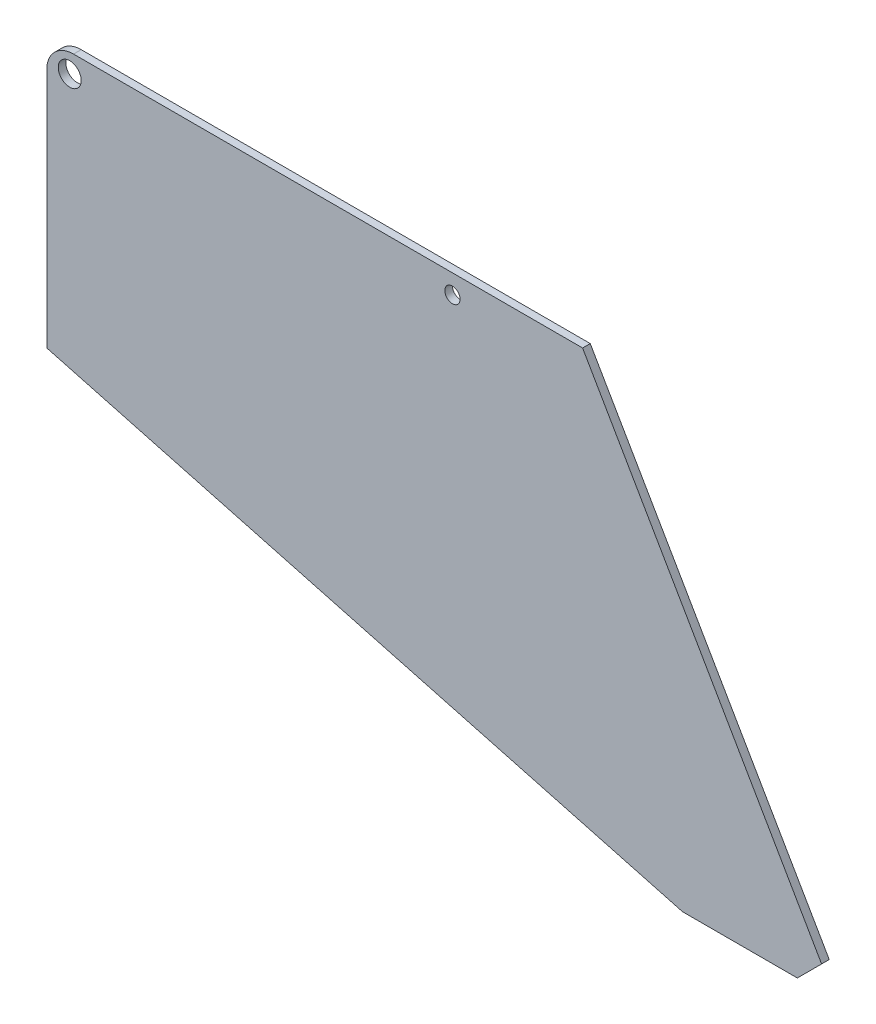
ISO-10303-21;
HEADER;
FILE_DESCRIPTION(('STEP AP214'),'2;1');
FILE_NAME('part.step','',(''),(''),'','','');
FILE_SCHEMA(('AUTOMOTIVE_DESIGN { 1 0 10303 214 1 1 1 1 }'));
ENDSEC;
DATA;
#1=APPLICATION_CONTEXT('core data for automotive mechanical design processes');
#2=APPLICATION_PROTOCOL_DEFINITION('international standard','automotive_design',2000,#1);
#3=PRODUCT_CONTEXT('',#1,'mechanical');
#4=PRODUCT('Part','Part','',(#3));
#5=PRODUCT_RELATED_PRODUCT_CATEGORY('part','',(#4));
#6=PRODUCT_DEFINITION_FORMATION('','',#4);
#7=PRODUCT_DEFINITION_CONTEXT('part definition',#1,'design');
#8=PRODUCT_DEFINITION('design','',#6,#7);
#9=PRODUCT_DEFINITION_SHAPE('','',#8);
#10=(LENGTH_UNIT() NAMED_UNIT(*) SI_UNIT(.MILLI.,.METRE.));
#11=(NAMED_UNIT(*) PLANE_ANGLE_UNIT() SI_UNIT($,.RADIAN.));
#12=(NAMED_UNIT(*) SI_UNIT($,.STERADIAN.) SOLID_ANGLE_UNIT());
#13=UNCERTAINTY_MEASURE_WITH_UNIT(LENGTH_MEASURE(1.E-05),#10,'distance_accuracy_value','');
#14=(GEOMETRIC_REPRESENTATION_CONTEXT(3) GLOBAL_UNCERTAINTY_ASSIGNED_CONTEXT((#13)) GLOBAL_UNIT_ASSIGNED_CONTEXT((#10,
#11,#12)) REPRESENTATION_CONTEXT('',''));
#15=CARTESIAN_POINT('',(0.,0.,0.));
#16=DIRECTION('',(0.,0.,1.));
#17=DIRECTION('',(1.,0.,0.));
#18=AXIS2_PLACEMENT_3D('',#15,#16,#17);
#19=CARTESIAN_POINT('',(-350.,0.,5.));
#20=DIRECTION('',(1.,0.,0.));
#21=DIRECTION('',(0.,0.,-1.));
#22=AXIS2_PLACEMENT_3D('',#19,#20,#21);
#23=PLANE('',#22);
#24=DIRECTION('',(0.,-1.,0.));
#25=VECTOR('',#24,1.);
#26=CARTESIAN_POINT('',(-350.,0.,5.));
#27=LINE('',#26,#25);
#28=CARTESIAN_POINT('',(-350.,140.,5.));
#29=VERTEX_POINT('',#28);
#30=CARTESIAN_POINT('',(-350.,-175.,5.));
#31=VERTEX_POINT('',#30);
#32=EDGE_CURVE('E102',#29,#31,#27,.T.);
#33=ORIENTED_EDGE('',*,*,#32,.F.);
#34=DIRECTION('',(0.,0.,-1.));
#35=VECTOR('',#34,1.);
#36=CARTESIAN_POINT('',(-350.,140.,5.));
#37=LINE('',#36,#35);
#38=CARTESIAN_POINT('',(-350.,140.,-5.));
#39=VERTEX_POINT('',#38);
#40=EDGE_CURVE('E127',#29,#39,#37,.T.);
#41=ORIENTED_EDGE('',*,*,#40,.T.);
#42=DIRECTION('',(0.,-1.,0.));
#43=VECTOR('',#42,1.);
#44=CARTESIAN_POINT('',(-350.,0.,-5.));
#45=LINE('',#44,#43);
#46=CARTESIAN_POINT('',(-350.,-175.,-5.));
#47=VERTEX_POINT('',#46);
#48=EDGE_CURVE('E125',#39,#47,#45,.T.);
#49=ORIENTED_EDGE('',*,*,#48,.T.);
#50=DIRECTION('',(0.,0.,-1.));
#51=VECTOR('',#50,1.);
#52=CARTESIAN_POINT('',(-350.,-175.,5.));
#53=LINE('',#52,#51);
#54=EDGE_CURVE('E119',#31,#47,#53,.T.);
#55=ORIENTED_EDGE('',*,*,#54,.F.);
#56=EDGE_LOOP('',(#33,#41,#49,#55));
#57=FACE_BOUND('',#56,.T.);
#58=ADVANCED_FACE('F43',(#57),#23,.F.);
#59=CARTESIAN_POINT('',(-67.195554337721,-250.777222831137,5.));
#60=DIRECTION('',(0.258819045102514,0.96592582628907,0.));
#61=DIRECTION('',(-0.96592582628907,0.258819045102514,0.));
#62=AXIS2_PLACEMENT_3D('',#59,#60,#61);
#63=PLANE('',#62);
#64=DIRECTION('',(0.96592582628907,-0.258819045102514,0.));
#65=VECTOR('',#64,1.);
#66=CARTESIAN_POINT('',(-67.195554337721,-250.777222831137,-5.));
#67=LINE('',#66,#65);
#68=CARTESIAN_POINT('',(480.560796608377,-397.548094716159,-5.));
#69=VERTEX_POINT('',#68);
#70=EDGE_CURVE('E158',#47,#69,#67,.T.);
#71=ORIENTED_EDGE('',*,*,#70,.T.);
#72=DIRECTION('',(0.,0.,-1.));
#73=VECTOR('',#72,1.);
#74=CARTESIAN_POINT('',(480.560796608377,-397.548094716159,5.));
#75=LINE('',#74,#73);
#76=CARTESIAN_POINT('',(480.560796608377,-397.548094716159,5.));
#77=VERTEX_POINT('',#76);
#78=EDGE_CURVE('E121',#77,#69,#75,.T.);
#79=ORIENTED_EDGE('',*,*,#78,.F.);
#80=DIRECTION('',(0.96592582628907,-0.258819045102514,0.));
#81=VECTOR('',#80,1.);
#82=CARTESIAN_POINT('',(-67.195554337721,-250.777222831137,5.));
#83=LINE('',#82,#81);
#84=EDGE_CURVE('E105',#31,#77,#83,.T.);
#85=ORIENTED_EDGE('',*,*,#84,.F.);
#86=ORIENTED_EDGE('',*,*,#54,.T.);
#87=EDGE_LOOP('',(#71,#79,#85,#86));
#88=FACE_BOUND('',#87,.T.);
#89=ADVANCED_FACE('F118',(#88),#63,.F.);
#90=CARTESIAN_POINT('',(0.,-397.548094716159,5.));
#91=DIRECTION('',(0.,1.,0.));
#92=DIRECTION('',(0.,0.,1.));
#93=AXIS2_PLACEMENT_3D('',#90,#91,#92);
#94=PLANE('',#93);
#95=DIRECTION('',(1.,0.,0.));
#96=VECTOR('',#95,1.);
#97=CARTESIAN_POINT('',(0.,-397.548094716159,-5.));
#98=LINE('',#97,#96);
#99=CARTESIAN_POINT('',(630.560796608377,-397.548094716159,-5.));
#100=VERTEX_POINT('',#99);
#101=EDGE_CURVE('E155',#69,#100,#98,.T.);
#102=ORIENTED_EDGE('',*,*,#101,.T.);
#103=DIRECTION('',(0.,0.,1.));
#104=VECTOR('',#103,1.);
#105=CARTESIAN_POINT('',(630.560796608377,-397.548094716159,5.));
#106=LINE('',#105,#104);
#107=CARTESIAN_POINT('',(630.560796608377,-397.548094716159,5.));
#108=VERTEX_POINT('',#107);
#109=EDGE_CURVE('E52',#100,#108,#106,.T.);
#110=ORIENTED_EDGE('',*,*,#109,.T.);
#111=DIRECTION('',(1.,0.,0.));
#112=VECTOR('',#111,1.);
#113=CARTESIAN_POINT('',(0.,-397.548094716159,5.));
#114=LINE('',#113,#112);
#115=EDGE_CURVE('E122',#77,#108,#114,.T.);
#116=ORIENTED_EDGE('',*,*,#115,.F.);
#117=ORIENTED_EDGE('',*,*,#78,.T.);
#118=EDGE_LOOP('',(#102,#110,#116,#117));
#119=FACE_BOUND('',#118,.T.);
#120=ADVANCED_FACE('F169',(#119),#94,.F.);
#121=CARTESIAN_POINT('',(338.27722283114,195.304445662275,5.));
#122=DIRECTION('',(-0.866025403784442,-0.499999999999995,0.));
#123=DIRECTION('',(0.499999999999995,-0.866025403784442,0.));
#124=AXIS2_PLACEMENT_3D('',#121,#122,#123);
#125=PLANE('',#124);
#126=DIRECTION('',(-0.499999999999995,0.866025403784442,0.));
#127=VECTOR('',#126,1.);
#128=CARTESIAN_POINT('',(338.27722283114,195.304445662275,5.));
#129=LINE('',#128,#127);
#130=CARTESIAN_POINT('',(662.259526419155,-365.84936490538,5.));
#131=VERTEX_POINT('',#130);
#132=CARTESIAN_POINT('',(350.,175.,5.));
#133=VERTEX_POINT('',#132);
#134=EDGE_CURVE('E149',#131,#133,#129,.T.);
#135=ORIENTED_EDGE('',*,*,#134,.F.);
#136=DIRECTION('',(0.,0.,-1.));
#137=VECTOR('',#136,1.);
#138=CARTESIAN_POINT('',(662.259526419155,-365.84936490538,5.));
#139=LINE('',#138,#137);
#140=CARTESIAN_POINT('',(662.259526419155,-365.84936490538,-5.));
#141=VERTEX_POINT('',#140);
#142=EDGE_CURVE('E139',#131,#141,#139,.T.);
#143=ORIENTED_EDGE('',*,*,#142,.T.);
#144=DIRECTION('',(-0.499999999999995,0.866025403784442,0.));
#145=VECTOR('',#144,1.);
#146=CARTESIAN_POINT('',(338.27722283114,195.304445662275,-5.));
#147=LINE('',#146,#145);
#148=CARTESIAN_POINT('',(350.,175.,-5.));
#149=VERTEX_POINT('',#148);
#150=EDGE_CURVE('E147',#141,#149,#147,.T.);
#151=ORIENTED_EDGE('',*,*,#150,.T.);
#152=DIRECTION('',(0.,0.,-1.));
#153=VECTOR('',#152,1.);
#154=CARTESIAN_POINT('',(350.,175.,5.));
#155=LINE('',#154,#153);
#156=EDGE_CURVE('E131',#133,#149,#155,.T.);
#157=ORIENTED_EDGE('',*,*,#156,.F.);
#158=EDGE_LOOP('',(#135,#143,#151,#157));
#159=FACE_BOUND('',#158,.T.);
#160=ADVANCED_FACE('F145',(#159),#125,.F.);
#161=CARTESIAN_POINT('',(0.,175.,5.));
#162=DIRECTION('',(0.,-1.,0.));
#163=DIRECTION('',(1.,0.,0.));
#164=AXIS2_PLACEMENT_3D('',#161,#162,#163);
#165=PLANE('',#164);
#166=DIRECTION('',(-1.,0.,0.));
#167=VECTOR('',#166,1.);
#168=CARTESIAN_POINT('',(0.,175.,-5.));
#169=LINE('',#168,#167);
#170=CARTESIAN_POINT('',(-315.,175.,-5.));
#171=VERTEX_POINT('',#170);
#172=EDGE_CURVE('E114',#149,#171,#169,.T.);
#173=ORIENTED_EDGE('',*,*,#172,.T.);
#174=DIRECTION('',(0.,0.,-1.));
#175=VECTOR('',#174,1.);
#176=CARTESIAN_POINT('',(-315.,175.,5.));
#177=LINE('',#176,#175);
#178=CARTESIAN_POINT('',(-315.,175.,5.));
#179=VERTEX_POINT('',#178);
#180=EDGE_CURVE('E136',#171,#179,#177,.F.);
#181=ORIENTED_EDGE('',*,*,#180,.T.);
#182=DIRECTION('',(-1.,0.,0.));
#183=VECTOR('',#182,1.);
#184=CARTESIAN_POINT('',(0.,175.,5.));
#185=LINE('',#184,#183);
#186=EDGE_CURVE('E161',#133,#179,#185,.T.);
#187=ORIENTED_EDGE('',*,*,#186,.F.);
#188=ORIENTED_EDGE('',*,*,#156,.T.);
#189=EDGE_LOOP('',(#173,#181,#187,#188));
#190=FACE_BOUND('',#189,.T.);
#191=ADVANCED_FACE('F195',(#190),#165,.F.);
#192=CARTESIAN_POINT('',(0.,0.,5.));
#193=DIRECTION('',(0.,0.,1.));
#194=DIRECTION('',(1.,0.,0.));
#195=AXIS2_PLACEMENT_3D('',#192,#193,#194);
#196=PLANE('',#195);
#197=CARTESIAN_POINT('',(-320.,150.,5.));
#198=DIRECTION('',(0.,0.,1.));
#199=DIRECTION('',(1.,0.,0.));
#200=AXIS2_PLACEMENT_3D('',#197,#198,#199);
#201=CIRCLE('',#200,15.);
#202=CARTESIAN_POINT('',(-305.,150.,5.));
#203=VERTEX_POINT('',#202);
#204=EDGE_CURVE('E177',#203,#203,#201,.T.);
#205=ORIENTED_EDGE('',*,*,#204,.F.);
#206=EDGE_LOOP('',(#205));
#207=FACE_BOUND('',#206,.T.);
#208=CARTESIAN_POINT('',(180.,150.,5.));
#209=DIRECTION('',(0.,0.,1.));
#210=DIRECTION('',(1.,0.,0.));
#211=AXIS2_PLACEMENT_3D('',#208,#209,#210);
#212=CIRCLE('',#211,10.);
#213=CARTESIAN_POINT('',(190.,150.,5.));
#214=VERTEX_POINT('',#213);
#215=EDGE_CURVE('E174',#214,#214,#212,.T.);
#216=ORIENTED_EDGE('',*,*,#215,.F.);
#217=EDGE_LOOP('',(#216));
#218=FACE_BOUND('',#217,.T.);
#219=ORIENTED_EDGE('',*,*,#115,.T.);
#220=DIRECTION('',(-0.707106781186548,-0.707106781186548,0.));
#221=VECTOR('',#220,1.);
#222=CARTESIAN_POINT('',(514.054445662268,-514.054445662268,5.));
#223=LINE('',#222,#221);
#224=EDGE_CURVE('E11',#108,#131,#223,.F.);
#225=ORIENTED_EDGE('',*,*,#224,.T.);
#226=ORIENTED_EDGE('',*,*,#134,.T.);
#227=ORIENTED_EDGE('',*,*,#186,.T.);
#228=CARTESIAN_POINT('',(-315.,140.,5.));
#229=DIRECTION('',(0.,0.,1.));
#230=DIRECTION('',(1.,0.,0.));
#231=AXIS2_PLACEMENT_3D('',#228,#229,#230);
#232=CIRCLE('',#231,35.);
#233=EDGE_CURVE('E109',#179,#29,#232,.T.);
#234=ORIENTED_EDGE('',*,*,#233,.T.);
#235=ORIENTED_EDGE('',*,*,#32,.T.);
#236=ORIENTED_EDGE('',*,*,#84,.T.);
#237=EDGE_LOOP('',(#219,#225,#226,#227,#234,#235,#236));
#238=FACE_BOUND('',#237,.T.);
#239=ADVANCED_FACE('F104',(#207,#218,#238),#196,.T.);
#240=CARTESIAN_POINT('',(0.,0.,-5.));
#241=DIRECTION('',(0.,0.,1.));
#242=DIRECTION('',(1.,0.,0.));
#243=AXIS2_PLACEMENT_3D('',#240,#241,#242);
#244=PLANE('',#243);
#245=CARTESIAN_POINT('',(-320.,150.,-5.));
#246=DIRECTION('',(0.,0.,1.));
#247=DIRECTION('',(1.,0.,0.));
#248=AXIS2_PLACEMENT_3D('',#245,#246,#247);
#249=CIRCLE('',#248,15.);
#250=CARTESIAN_POINT('',(-305.,150.,-5.));
#251=VERTEX_POINT('',#250);
#252=EDGE_CURVE('E168',#251,#251,#249,.T.);
#253=ORIENTED_EDGE('',*,*,#252,.T.);
#254=EDGE_LOOP('',(#253));
#255=FACE_BOUND('',#254,.T.);
#256=CARTESIAN_POINT('',(180.,150.,-5.));
#257=DIRECTION('',(0.,0.,1.));
#258=DIRECTION('',(1.,0.,0.));
#259=AXIS2_PLACEMENT_3D('',#256,#257,#258);
#260=CIRCLE('',#259,10.);
#261=CARTESIAN_POINT('',(190.,150.,-5.));
#262=VERTEX_POINT('',#261);
#263=EDGE_CURVE('E171',#262,#262,#260,.T.);
#264=ORIENTED_EDGE('',*,*,#263,.T.);
#265=EDGE_LOOP('',(#264));
#266=FACE_BOUND('',#265,.T.);
#267=ORIENTED_EDGE('',*,*,#150,.F.);
#268=DIRECTION('',(0.707106781186548,0.707106781186548,0.));
#269=VECTOR('',#268,1.);
#270=CARTESIAN_POINT('',(662.259526419155,-365.84936490538,-5.));
#271=LINE('',#270,#269);
#272=EDGE_CURVE('E66',#141,#100,#271,.F.);
#273=ORIENTED_EDGE('',*,*,#272,.T.);
#274=ORIENTED_EDGE('',*,*,#101,.F.);
#275=ORIENTED_EDGE('',*,*,#70,.F.);
#276=ORIENTED_EDGE('',*,*,#48,.F.);
#277=CARTESIAN_POINT('',(-315.,140.,-5.));
#278=DIRECTION('',(0.,0.,1.));
#279=DIRECTION('',(1.,0.,0.));
#280=AXIS2_PLACEMENT_3D('',#277,#278,#279);
#281=CIRCLE('',#280,35.);
#282=EDGE_CURVE('E129',#39,#171,#281,.F.);
#283=ORIENTED_EDGE('',*,*,#282,.T.);
#284=ORIENTED_EDGE('',*,*,#172,.F.);
#285=EDGE_LOOP('',(#267,#273,#274,#275,#276,#283,#284));
#286=FACE_BOUND('',#285,.T.);
#287=ADVANCED_FACE('F153',(#255,#266,#286),#244,.F.);
#288=CARTESIAN_POINT('',(180.,150.,-5.));
#289=DIRECTION('',(0.,0.,1.));
#290=DIRECTION('',(1.,0.,0.));
#291=AXIS2_PLACEMENT_3D('',#288,#289,#290);
#292=CYLINDRICAL_SURFACE('',#291,10.);
#293=ORIENTED_EDGE('',*,*,#263,.F.);
#294=EDGE_LOOP('',(#293));
#295=FACE_BOUND('',#294,.T.);
#296=ORIENTED_EDGE('',*,*,#215,.T.);
#297=EDGE_LOOP('',(#296));
#298=FACE_BOUND('',#297,.T.);
#299=ADVANCED_FACE('F189',(#295,#298),#292,.F.);
#300=CARTESIAN_POINT('',(-320.,150.,-5.));
#301=DIRECTION('',(0.,0.,1.));
#302=DIRECTION('',(1.,0.,0.));
#303=AXIS2_PLACEMENT_3D('',#300,#301,#302);
#304=CYLINDRICAL_SURFACE('',#303,15.);
#305=ORIENTED_EDGE('',*,*,#252,.F.);
#306=EDGE_LOOP('',(#305));
#307=FACE_BOUND('',#306,.T.);
#308=ORIENTED_EDGE('',*,*,#204,.T.);
#309=EDGE_LOOP('',(#308));
#310=FACE_BOUND('',#309,.T.);
#311=ADVANCED_FACE('F185',(#307,#310),#304,.F.);
#312=CARTESIAN_POINT('',(-315.,140.,5.));
#313=DIRECTION('',(0.,0.,-1.));
#314=DIRECTION('',(-1.,0.,0.));
#315=AXIS2_PLACEMENT_3D('',#312,#313,#314);
#316=CYLINDRICAL_SURFACE('',#315,35.);
#317=ORIENTED_EDGE('',*,*,#233,.F.);
#318=ORIENTED_EDGE('',*,*,#180,.F.);
#319=ORIENTED_EDGE('',*,*,#282,.F.);
#320=ORIENTED_EDGE('',*,*,#40,.F.);
#321=EDGE_LOOP('',(#317,#318,#319,#320));
#322=FACE_BOUND('',#321,.T.);
#323=ADVANCED_FACE('F188',(#322),#316,.T.);
#324=CARTESIAN_POINT('',(662.259526419155,-365.84936490538,5.));
#325=DIRECTION('',(-0.707106781186547,0.707106781186547,0.));
#326=DIRECTION('',(0.,0.,-1.));
#327=AXIS2_PLACEMENT_3D('',#324,#325,#326);
#328=PLANE('',#327);
#329=ORIENTED_EDGE('',*,*,#224,.F.);
#330=ORIENTED_EDGE('',*,*,#109,.F.);
#331=ORIENTED_EDGE('',*,*,#272,.F.);
#332=ORIENTED_EDGE('',*,*,#142,.F.);
#333=EDGE_LOOP('',(#329,#330,#331,#332));
#334=FACE_BOUND('',#333,.T.);
#335=ADVANCED_FACE('F46',(#334),#328,.F.);
#336=CLOSED_SHELL('',(#58,#89,#120,#160,#191,#239,#287,#299,#311,#323,#335));
#337=MANIFOLD_SOLID_BREP('B2',#336);
#338=ADVANCED_BREP_SHAPE_REPRESENTATION('',(#18,#337),#14);
#339=SHAPE_DEFINITION_REPRESENTATION(#9,#338);
ENDSEC;
END-ISO-10303-21;
